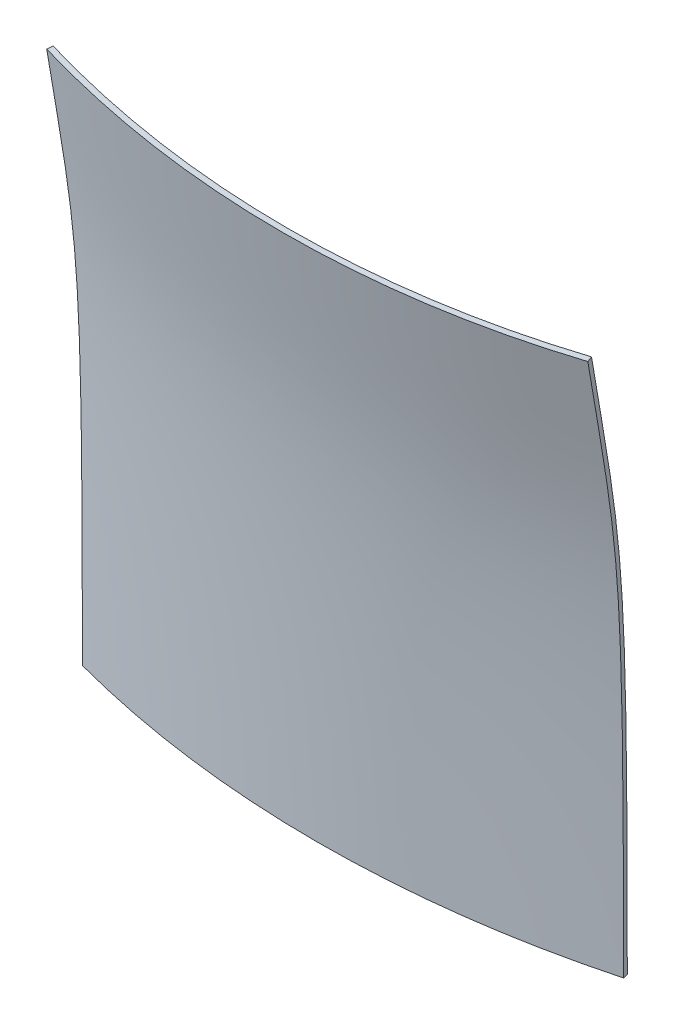
ISO-10303-21;
HEADER;
FILE_DESCRIPTION(('STEP AP214'),'2;1');
FILE_NAME('part.step','',(''),(''),'','','');
FILE_SCHEMA(('AUTOMOTIVE_DESIGN { 1 0 10303 214 1 1 1 1 }'));
ENDSEC;
DATA;
#1=APPLICATION_CONTEXT('core data for automotive mechanical design processes');
#2=APPLICATION_PROTOCOL_DEFINITION('international standard','automotive_design',2000,#1);
#3=PRODUCT_CONTEXT('',#1,'mechanical');
#4=PRODUCT('Part','Part','',(#3));
#5=PRODUCT_RELATED_PRODUCT_CATEGORY('part','',(#4));
#6=PRODUCT_DEFINITION_FORMATION('','',#4);
#7=PRODUCT_DEFINITION_CONTEXT('part definition',#1,'design');
#8=PRODUCT_DEFINITION('design','',#6,#7);
#9=PRODUCT_DEFINITION_SHAPE('','',#8);
#10=(LENGTH_UNIT() NAMED_UNIT(*) SI_UNIT(.MILLI.,.METRE.));
#11=(NAMED_UNIT(*) PLANE_ANGLE_UNIT() SI_UNIT($,.RADIAN.));
#12=(NAMED_UNIT(*) SI_UNIT($,.STERADIAN.) SOLID_ANGLE_UNIT());
#13=UNCERTAINTY_MEASURE_WITH_UNIT(LENGTH_MEASURE(1.E-05),#10,'distance_accuracy_value','');
#14=(GEOMETRIC_REPRESENTATION_CONTEXT(3) GLOBAL_UNCERTAINTY_ASSIGNED_CONTEXT((#13)) GLOBAL_UNIT_ASSIGNED_CONTEXT((#10,
#11,#12)) REPRESENTATION_CONTEXT('',''));
#15=CARTESIAN_POINT('',(0.,0.,0.));
#16=DIRECTION('',(0.,0.,1.));
#17=DIRECTION('',(1.,0.,0.));
#18=AXIS2_PLACEMENT_3D('',#15,#16,#17);
#19=CARTESIAN_POINT('',(191.158681413735,87.845845462449,-834.005670105788));
#20=DIRECTION('',(0.,0.98601329718327,0.166666666666666));
#21=DIRECTION('',(0.,-0.166666666666666,0.98601329718327));
#22=AXIS2_PLACEMENT_3D('',#19,#20,#21);
#23=PLANE('',#22);
#24=CARTESIAN_POINT('',(191.158681413735,87.845845462449,-834.005670105788));
#25=DIRECTION('',(0.,-0.98601329718327,-0.166666666666666));
#26=DIRECTION('',(0.,-0.166666666666666,0.98601329718327));
#27=AXIS2_PLACEMENT_3D('',#24,#25,#26);
#28=CIRCLE('',#27,753.713083454829);
#29=CARTESIAN_POINT('',(385.177919221497,-33.5396684466883,-115.879285306778));
#30=VERTEX_POINT('',#29);
#31=CARTESIAN_POINT('',(-2.86055639402725,-33.5396684466883,-115.879285306778));
#32=VERTEX_POINT('',#31);
#33=EDGE_CURVE('E144',#30,#32,#28,.T.);
#34=ORIENTED_EDGE('',*,*,#33,.T.);
#35=DIRECTION('',(-0.257417898225189,-0.161050028948332,0.952784820328844));
#36=VECTOR('',#35,1.);
#37=CARTESIAN_POINT('',(-3.8413185862653,-34.1532690569815,-112.249175141325));
#38=LINE('',#37,#36);
#39=CARTESIAN_POINT('',(-3.8413185862653,-34.1532690569815,-112.249175141325));
#40=VERTEX_POINT('',#39);
#41=EDGE_CURVE('E171',#32,#40,#38,.T.);
#42=ORIENTED_EDGE('',*,*,#41,.T.);
#43=CARTESIAN_POINT('',(191.158681413735,87.845845462449,-834.005670105788));
#44=DIRECTION('',(0.,0.98601329718327,0.166666666666666));
#45=DIRECTION('',(0.,-0.166666666666666,0.98601329718327));
#46=AXIS2_PLACEMENT_3D('',#43,#44,#45);
#47=CIRCLE('',#46,757.523083454829);
#48=CARTESIAN_POINT('',(386.158681413735,-34.1532690569815,-112.249175141325));
#49=VERTEX_POINT('',#48);
#50=EDGE_CURVE('E137',#40,#49,#47,.T.);
#51=ORIENTED_EDGE('',*,*,#50,.T.);
#52=DIRECTION('',(-0.257417898225207,0.161050028948331,-0.952784820328839));
#53=VECTOR('',#52,1.);
#54=CARTESIAN_POINT('',(385.177919221497,-33.5396684466883,-115.879285306778));
#55=LINE('',#54,#53);
#56=EDGE_CURVE('E141',#49,#30,#55,.T.);
#57=ORIENTED_EDGE('',*,*,#56,.T.);
#58=EDGE_LOOP('',(#34,#42,#51,#57));
#59=FACE_BOUND('',#58,.T.);
#60=ADVANCED_FACE('F99',(#59),#23,.T.);
#61=CARTESIAN_POINT('',(191.158681413735,-431.8,-869.975072774691));
#62=DIRECTION('',(0.,1.,0.));
#63=DIRECTION('',(0.,0.,1.));
#64=AXIS2_PLACEMENT_3D('',#61,#62,#63);
#65=PLANE('',#64);
#66=CARTESIAN_POINT('',(191.158681413735,-431.8,-869.975072774691));
#67=DIRECTION('',(0.,-1.,0.));
#68=DIRECTION('',(0.,0.,1.));
#69=AXIS2_PLACEMENT_3D('',#66,#67,#68);
#70=CIRCLE('',#69,753.713083454821);
#71=CARTESIAN_POINT('',(385.177919221497,-431.8,-141.66198931987));
#72=VERTEX_POINT('',#71);
#73=CARTESIAN_POINT('',(-2.86055639402733,-431.8,-141.66198931987));
#74=VERTEX_POINT('',#73);
#75=EDGE_CURVE('E187',#72,#74,#70,.T.);
#76=ORIENTED_EDGE('',*,*,#75,.F.);
#77=DIRECTION('',(-0.25741789822521,0.,-0.966300173689995));
#78=VECTOR('',#77,1.);
#79=CARTESIAN_POINT('',(385.177919221497,-431.8,-141.66198931987));
#80=LINE('',#79,#78);
#81=CARTESIAN_POINT('',(386.158681413735,-431.8,-137.980385658111));
#82=VERTEX_POINT('',#81);
#83=EDGE_CURVE('E168',#82,#72,#80,.T.);
#84=ORIENTED_EDGE('',*,*,#83,.F.);
#85=CARTESIAN_POINT('',(191.158681413735,-431.8,-869.975072774691));
#86=DIRECTION('',(0.,1.,0.));
#87=DIRECTION('',(0.,0.,1.));
#88=AXIS2_PLACEMENT_3D('',#85,#86,#87);
#89=CIRCLE('',#88,757.523083454821);
#90=CARTESIAN_POINT('',(-3.84131858626532,-431.8,-137.980385658111));
#91=VERTEX_POINT('',#90);
#92=EDGE_CURVE('E110',#91,#82,#89,.T.);
#93=ORIENTED_EDGE('',*,*,#92,.F.);
#94=DIRECTION('',(-0.257417898225195,0.,0.96630017369));
#95=VECTOR('',#94,1.);
#96=CARTESIAN_POINT('',(-2.86055639402733,-431.8,-141.66198931987));
#97=LINE('',#96,#95);
#98=EDGE_CURVE('E12',#74,#91,#97,.T.);
#99=ORIENTED_EDGE('',*,*,#98,.F.);
#100=EDGE_LOOP('',(#76,#84,#93,#99));
#101=FACE_BOUND('',#100,.T.);
#102=ADVANCED_FACE('F241',(#101),#65,.F.);
#103=CARTESIAN_POINT('',(-2.86055639402733,-431.8,-141.66198931987));
#104=CARTESIAN_POINT('',(-2.86055639402733,-165.737317732013,-141.66198931987));
#105=CARTESIAN_POINT('',(-2.86055639402726,-164.71033974693,-138.051175495777));
#106=CARTESIAN_POINT('',(-2.86055639402725,-33.5396684466883,-115.879285306778));
#107=CARTESIAN_POINT('',(-3.18747712477333,-431.8,-140.434788099284));
#108=CARTESIAN_POINT('',(-3.18747712477333,-165.874127796019,-140.434788099284));
#109=CARTESIAN_POINT('',(-3.18747712477327,-164.847425012545,-136.829737935292));
#110=CARTESIAN_POINT('',(-3.18747712477327,-33.7442019834527,-114.669248584961));
#111=CARTESIAN_POINT('',(-3.51439785551933,-431.8,-139.207586878697));
#112=CARTESIAN_POINT('',(-3.51439785551933,-166.010937860024,-139.207586878697));
#113=CARTESIAN_POINT('',(-3.51439785551928,-164.98451027816,-135.608300374807));
#114=CARTESIAN_POINT('',(-3.51439785551928,-33.9487355202171,-113.459211863143));
#115=CARTESIAN_POINT('',(-3.84131858626532,-431.8,-137.980385658111));
#116=CARTESIAN_POINT('',(-3.84131858626532,-166.14774792403,-137.980385658111));
#117=CARTESIAN_POINT('',(-3.8413185862653,-165.121595543776,-134.386862814323));
#118=CARTESIAN_POINT('',(-3.8413185862653,-34.1532690569815,-112.249175141325));
#119=B_SPLINE_SURFACE_WITH_KNOTS('',3,3,((#103,#104,#105,#106),(#107,#108,#109,#110),(#111,#112,
#113,#114),(#115,#116,#117,#118)),.UNSPECIFIED.,.F.,.F.,.F.,(4,4),(4,4),(0.,1.),(0.,1.),.UNSPECIFIED.);
#120=CARTESIAN_POINT('',(-3.84131858626532,-431.8,-137.980385658111));
#121=CARTESIAN_POINT('',(-3.84131858626532,-166.14774792403,-137.980385658111));
#122=CARTESIAN_POINT('',(-3.8413185862653,-165.121595543776,-134.386862814323));
#123=CARTESIAN_POINT('',(-3.8413185862653,-34.1532690569815,-112.249175141325));
#124=B_SPLINE_CURVE_WITH_KNOTS('',3,(#120,#121,#122,#123),.UNSPECIFIED.,.F.,.F.,(4,4),(0.,1.),.UNSPECIFIED.);
#125=EDGE_CURVE('E119',#91,#40,#124,.T.);
#126=CARTESIAN_POINT('',(-2.86055639402733,-431.8,-141.66198931987));
#127=CARTESIAN_POINT('',(-2.86055639402733,-165.737317732013,-141.66198931987));
#128=CARTESIAN_POINT('',(-2.86055639402726,-164.71033974693,-138.051175495777));
#129=CARTESIAN_POINT('',(-2.86055639402725,-33.5396684466883,-115.879285306778));
#130=B_SPLINE_CURVE_WITH_KNOTS('',3,(#126,#127,#128,#129),.UNSPECIFIED.,.F.,.F.,(4,4),(0.,1.),.UNSPECIFIED.);
#131=EDGE_CURVE('E161',#32,#74,#130,.F.);
#132=ORIENTED_EDGE('',*,*,#98,.T.);
#133=ORIENTED_EDGE('',*,*,#125,.T.);
#134=ORIENTED_EDGE('',*,*,#41,.F.);
#135=ORIENTED_EDGE('',*,*,#131,.T.);
#136=EDGE_LOOP('',(#132,#133,#134,#135));
#137=FACE_BOUND('',#136,.T.);
#138=ADVANCED_FACE('F249',(#137),#119,.T.);
#139=CARTESIAN_POINT('',(-3.8413185862653,-431.8,-137.980385658111));
#140=CARTESIAN_POINT('',(-3.8413185862653,-166.14774792403,-137.980385658111));
#141=CARTESIAN_POINT('',(-3.84131858626532,-165.121595543776,-134.386862814323));
#142=CARTESIAN_POINT('',(-3.84131858626532,-34.1532690569815,-112.249175141325));
#143=CARTESIAN_POINT('',(123.926969957342,-431.8,-103.943504373977));
#144=CARTESIAN_POINT('',(123.926969957342,-166.14774792403,-103.943504373977));
#145=CARTESIAN_POINT('',(123.926969957342,-170.794409091131,-100.826045273519));
#146=CARTESIAN_POINT('',(123.926969957342,-39.826082604337,-78.6883576005216));
#147=CARTESIAN_POINT('',(258.390392870127,-431.8,-103.943504373978));
#148=CARTESIAN_POINT('',(258.390392870127,-166.14774792403,-103.943504373978));
#149=CARTESIAN_POINT('',(258.390392870127,-170.794409091131,-100.826045273519));
#150=CARTESIAN_POINT('',(258.390392870127,-39.8260826043369,-78.6883576005215));
#151=CARTESIAN_POINT('',(386.158681413735,-431.8,-137.980385658111));
#152=CARTESIAN_POINT('',(386.158681413735,-166.14774792403,-137.980385658111));
#153=CARTESIAN_POINT('',(386.158681413735,-165.121595543776,-134.386862814323));
#154=CARTESIAN_POINT('',(386.158681413735,-34.1532690569814,-112.249175141325));
#155=B_SPLINE_SURFACE_WITH_KNOTS('',3,3,((#139,#140,#141,#142),(#143,#144,#145,#146),(#147,#148,
#149,#150),(#151,#152,#153,#154)),.UNSPECIFIED.,.F.,.F.,.F.,(4,4),(4,4),(0.,1.),(0.,1.),.UNSPECIFIED.);
#156=CARTESIAN_POINT('',(386.158681413735,-431.8,-137.980385658111));
#157=CARTESIAN_POINT('',(386.158681413735,-166.14774792403,-137.980385658111));
#158=CARTESIAN_POINT('',(386.158681413735,-165.121595543776,-134.386862814323));
#159=CARTESIAN_POINT('',(386.158681413735,-34.1532690569814,-112.249175141325));
#160=B_SPLINE_CURVE_WITH_KNOTS('',3,(#156,#157,#158,#159),.UNSPECIFIED.,.F.,.F.,(4,4),(0.,1.),.UNSPECIFIED.);
#161=EDGE_CURVE('E170',#82,#49,#160,.T.);
#162=ORIENTED_EDGE('',*,*,#92,.T.);
#163=ORIENTED_EDGE('',*,*,#161,.T.);
#164=ORIENTED_EDGE('',*,*,#50,.F.);
#165=ORIENTED_EDGE('',*,*,#125,.F.);
#166=EDGE_LOOP('',(#162,#163,#164,#165));
#167=FACE_BOUND('',#166,.T.);
#168=ADVANCED_FACE('F203',(#167),#155,.T.);
#169=CARTESIAN_POINT('',(385.177919221497,-431.8,-141.66198931987));
#170=CARTESIAN_POINT('',(385.177919221497,-165.737317732013,-141.66198931987));
#171=CARTESIAN_POINT('',(385.177919221497,-164.710339746929,-138.051175495777));
#172=CARTESIAN_POINT('',(385.177919221497,-33.5396684466883,-115.879285306779));
#173=CARTESIAN_POINT('',(258.052247635687,-431.8,-107.796298221917));
#174=CARTESIAN_POINT('',(258.052247635687,-165.737317732013,-107.796298221917));
#175=CARTESIAN_POINT('',(258.052247635687,-170.354621596588,-104.659153754895));
#176=CARTESIAN_POINT('',(258.052247635687,-39.1839502963471,-82.487263565896));
#177=CARTESIAN_POINT('',(124.265115191783,-431.8,-107.796298221917));
#178=CARTESIAN_POINT('',(124.265115191783,-165.737317732013,-107.796298221917));
#179=CARTESIAN_POINT('',(124.265115191783,-170.354621596588,-104.659153754895));
#180=CARTESIAN_POINT('',(124.265115191783,-39.1839502963471,-82.4872635658957));
#181=CARTESIAN_POINT('',(-2.86055639402696,-431.8,-141.66198931987));
#182=CARTESIAN_POINT('',(-2.86055639402696,-165.737317732013,-141.66198931987));
#183=CARTESIAN_POINT('',(-2.86055639402699,-164.710339746929,-138.051175495777));
#184=CARTESIAN_POINT('',(-2.86055639402699,-33.5396684466883,-115.879285306778));
#185=B_SPLINE_SURFACE_WITH_KNOTS('',3,3,((#169,#170,#171,#172),(#173,#174,#175,#176),(#177,#178,
#179,#180),(#181,#182,#183,#184)),.UNSPECIFIED.,.F.,.F.,.F.,(4,4),(4,4),(0.,1.),(0.,1.),.UNSPECIFIED.);
#186=CARTESIAN_POINT('',(385.177919221497,-431.8,-141.66198931987));
#187=CARTESIAN_POINT('',(385.177919221497,-165.737317732013,-141.66198931987));
#188=CARTESIAN_POINT('',(385.177919221497,-164.71033974693,-138.051175495777));
#189=CARTESIAN_POINT('',(385.177919221497,-33.5396684466883,-115.879285306778));
#190=B_SPLINE_CURVE_WITH_KNOTS('',3,(#186,#187,#188,#189),.UNSPECIFIED.,.F.,.F.,(4,4),(0.,1.),.UNSPECIFIED.);
#191=EDGE_CURVE('E158',#72,#30,#190,.T.);
#192=ORIENTED_EDGE('',*,*,#75,.T.);
#193=ORIENTED_EDGE('',*,*,#131,.F.);
#194=ORIENTED_EDGE('',*,*,#33,.F.);
#195=ORIENTED_EDGE('',*,*,#191,.F.);
#196=EDGE_LOOP('',(#192,#193,#194,#195));
#197=FACE_BOUND('',#196,.T.);
#198=ADVANCED_FACE('F157',(#197),#185,.T.);
#199=CARTESIAN_POINT('',(386.158681413735,-431.8,-137.980385658111));
#200=CARTESIAN_POINT('',(386.158681413735,-166.14774792403,-137.980385658111));
#201=CARTESIAN_POINT('',(386.158681413735,-165.121595543776,-134.386862814323));
#202=CARTESIAN_POINT('',(386.158681413735,-34.1532690569815,-112.249175141325));
#203=CARTESIAN_POINT('',(385.831760682989,-431.8,-139.207586878697));
#204=CARTESIAN_POINT('',(385.831760682989,-166.010937860024,-139.207586878697));
#205=CARTESIAN_POINT('',(385.831760682989,-164.98451027816,-135.608300374807));
#206=CARTESIAN_POINT('',(385.831760682989,-33.9487355202171,-113.459211863143));
#207=CARTESIAN_POINT('',(385.504839952243,-431.8,-140.434788099284));
#208=CARTESIAN_POINT('',(385.504839952243,-165.874127796019,-140.434788099284));
#209=CARTESIAN_POINT('',(385.504839952243,-164.847425012545,-136.829737935292));
#210=CARTESIAN_POINT('',(385.504839952243,-33.7442019834527,-114.669248584961));
#211=CARTESIAN_POINT('',(385.177919221497,-431.8,-141.66198931987));
#212=CARTESIAN_POINT('',(385.177919221497,-165.737317732013,-141.66198931987));
#213=CARTESIAN_POINT('',(385.177919221497,-164.71033974693,-138.051175495777));
#214=CARTESIAN_POINT('',(385.177919221497,-33.5396684466883,-115.879285306778));
#215=B_SPLINE_SURFACE_WITH_KNOTS('',3,3,((#199,#200,#201,#202),(#203,#204,#205,#206),(#207,#208,
#209,#210),(#211,#212,#213,#214)),.UNSPECIFIED.,.F.,.F.,.F.,(4,4),(4,4),(0.,1.),(0.,1.),.UNSPECIFIED.);
#216=ORIENTED_EDGE('',*,*,#83,.T.);
#217=ORIENTED_EDGE('',*,*,#191,.T.);
#218=ORIENTED_EDGE('',*,*,#56,.F.);
#219=ORIENTED_EDGE('',*,*,#161,.F.);
#220=EDGE_LOOP('',(#216,#217,#218,#219));
#221=FACE_BOUND('',#220,.T.);
#222=ADVANCED_FACE('F166',(#221),#215,.T.);
#223=CLOSED_SHELL('',(#60,#102,#138,#168,#198,#222));
#224=MANIFOLD_SOLID_BREP('B2',#223);
#225=ADVANCED_BREP_SHAPE_REPRESENTATION('',(#18,#224),#14);
#226=SHAPE_DEFINITION_REPRESENTATION(#9,#225);
ENDSEC;
END-ISO-10303-21;
